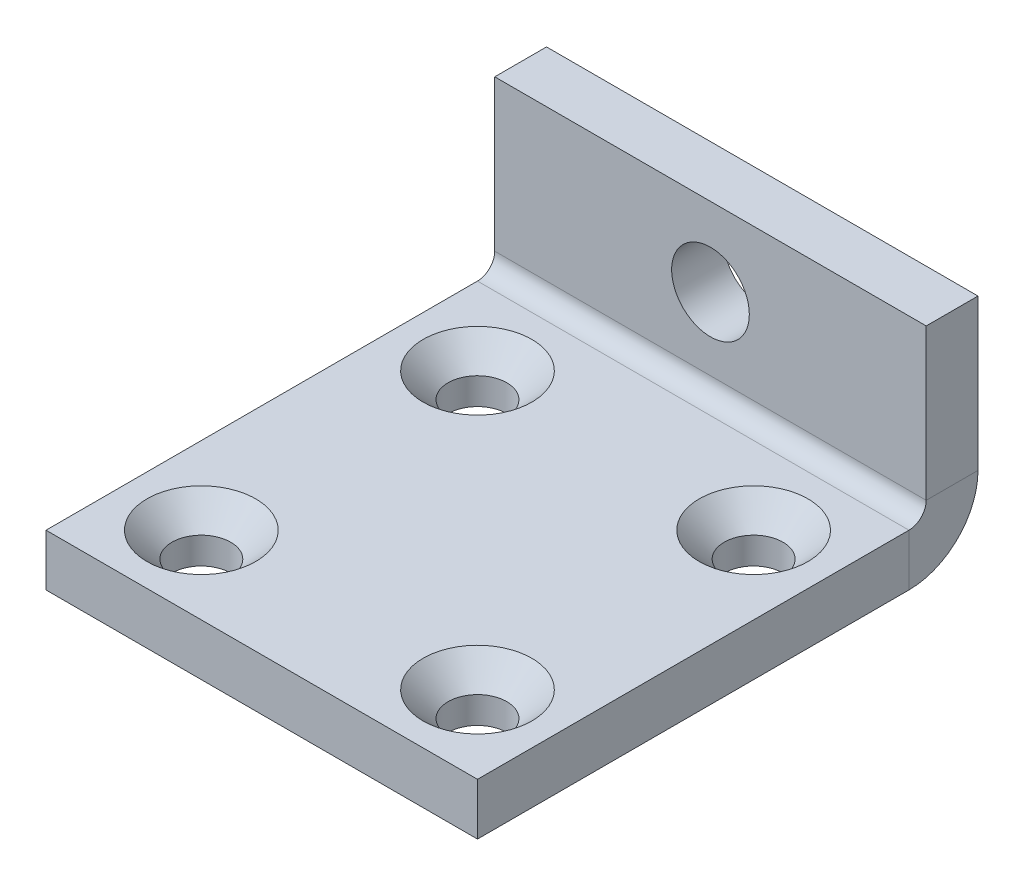
ISO-10303-21;
HEADER;
FILE_DESCRIPTION(('STEP AP214'),'2;1');
FILE_NAME('part.step','',(''),(''),'','','');
FILE_SCHEMA(('AUTOMOTIVE_DESIGN { 1 0 10303 214 1 1 1 1 }'));
ENDSEC;
DATA;
#1=APPLICATION_CONTEXT('core data for automotive mechanical design processes');
#2=APPLICATION_PROTOCOL_DEFINITION('international standard','automotive_design',2000,#1);
#3=PRODUCT_CONTEXT('',#1,'mechanical');
#4=PRODUCT('Part','Part','',(#3));
#5=PRODUCT_RELATED_PRODUCT_CATEGORY('part','',(#4));
#6=PRODUCT_DEFINITION_FORMATION('','',#4);
#7=PRODUCT_DEFINITION_CONTEXT('part definition',#1,'design');
#8=PRODUCT_DEFINITION('design','',#6,#7);
#9=PRODUCT_DEFINITION_SHAPE('','',#8);
#10=(LENGTH_UNIT() NAMED_UNIT(*) SI_UNIT(.MILLI.,.METRE.));
#11=(NAMED_UNIT(*) PLANE_ANGLE_UNIT() SI_UNIT($,.RADIAN.));
#12=(NAMED_UNIT(*) SI_UNIT($,.STERADIAN.) SOLID_ANGLE_UNIT());
#13=UNCERTAINTY_MEASURE_WITH_UNIT(LENGTH_MEASURE(1.E-05),#10,'distance_accuracy_value','');
#14=(GEOMETRIC_REPRESENTATION_CONTEXT(3) GLOBAL_UNCERTAINTY_ASSIGNED_CONTEXT((#13)) GLOBAL_UNIT_ASSIGNED_CONTEXT((#10,
#11,#12)) REPRESENTATION_CONTEXT('',''));
#15=CARTESIAN_POINT('',(0.,0.,0.));
#16=DIRECTION('',(0.,0.,1.));
#17=DIRECTION('',(1.,0.,0.));
#18=AXIS2_PLACEMENT_3D('',#15,#16,#17);
#19=CARTESIAN_POINT('',(25.,0.,3.99999999999999));
#20=DIRECTION('',(1.,0.,0.));
#21=DIRECTION('',(0.,0.,-1.));
#22=AXIS2_PLACEMENT_3D('',#19,#20,#21);
#23=PLANE('',#22);
#24=DIRECTION('',(0.,1.,0.));
#25=VECTOR('',#24,1.);
#26=CARTESIAN_POINT('',(25.,0.,3.99999999999999));
#27=LINE('',#26,#25);
#28=CARTESIAN_POINT('',(25.,0.,3.99999999999999));
#29=VERTEX_POINT('',#28);
#30=CARTESIAN_POINT('',(25.,3.,3.99999999999999));
#31=VERTEX_POINT('',#30);
#32=EDGE_CURVE('E11',#29,#31,#27,.T.);
#33=ORIENTED_EDGE('',*,*,#32,.F.);
#34=CARTESIAN_POINT('',(25.,4.,3.99999999999999));
#35=DIRECTION('',(-1.,0.,0.));
#36=DIRECTION('',(0.,0.,1.));
#37=AXIS2_PLACEMENT_3D('',#34,#35,#36);
#38=CIRCLE('',#37,4.);
#39=CARTESIAN_POINT('',(25.,4.,0.));
#40=VERTEX_POINT('',#39);
#41=EDGE_CURVE('E126',#29,#40,#38,.F.);
#42=ORIENTED_EDGE('',*,*,#41,.T.);
#43=DIRECTION('',(0.,0.,-1.));
#44=VECTOR('',#43,1.);
#45=CARTESIAN_POINT('',(25.,4.,2.99999999999999));
#46=LINE('',#45,#44);
#47=CARTESIAN_POINT('',(25.,4.,2.99999999999999));
#48=VERTEX_POINT('',#47);
#49=EDGE_CURVE('E44',#48,#40,#46,.T.);
#50=ORIENTED_EDGE('',*,*,#49,.F.);
#51=CARTESIAN_POINT('',(25.,4.,3.99999999999999));
#52=DIRECTION('',(1.,0.,0.));
#53=DIRECTION('',(0.,0.,-1.));
#54=AXIS2_PLACEMENT_3D('',#51,#52,#53);
#55=CIRCLE('',#54,1.);
#56=EDGE_CURVE('E133',#31,#48,#55,.T.);
#57=ORIENTED_EDGE('',*,*,#56,.F.);
#58=EDGE_LOOP('',(#33,#42,#50,#57));
#59=FACE_BOUND('',#58,.T.);
#60=ADVANCED_FACE('F36',(#59),#23,.T.);
#61=CARTESIAN_POINT('',(25.,4.,2.99999999999999));
#62=DIRECTION('',(1.,0.,0.));
#63=DIRECTION('',(0.,0.,-1.));
#64=AXIS2_PLACEMENT_3D('',#61,#62,#63);
#65=PLANE('',#64);
#66=DIRECTION('',(0.,0.,-1.));
#67=VECTOR('',#66,1.);
#68=CARTESIAN_POINT('',(25.,0.,0.));
#69=LINE('',#68,#67);
#70=CARTESIAN_POINT('',(25.,0.,29.));
#71=VERTEX_POINT('',#70);
#72=EDGE_CURVE('E121',#71,#29,#69,.T.);
#73=ORIENTED_EDGE('',*,*,#72,.T.);
#74=ORIENTED_EDGE('',*,*,#32,.T.);
#75=DIRECTION('',(0.,0.,-1.));
#76=VECTOR('',#75,1.);
#77=CARTESIAN_POINT('',(25.,3.,0.));
#78=LINE('',#77,#76);
#79=CARTESIAN_POINT('',(25.,3.,29.));
#80=VERTEX_POINT('',#79);
#81=EDGE_CURVE('E131',#80,#31,#78,.T.);
#82=ORIENTED_EDGE('',*,*,#81,.F.);
#83=DIRECTION('',(0.,1.,0.));
#84=VECTOR('',#83,1.);
#85=CARTESIAN_POINT('',(25.,0.,29.));
#86=LINE('',#85,#84);
#87=EDGE_CURVE('E112',#71,#80,#86,.T.);
#88=ORIENTED_EDGE('',*,*,#87,.F.);
#89=EDGE_LOOP('',(#73,#74,#82,#88));
#90=FACE_BOUND('',#89,.T.);
#91=ADVANCED_FACE('F129',(#90),#65,.T.);
#92=CARTESIAN_POINT('',(0.,4.,0.));
#93=DIRECTION('',(-1.,0.,0.));
#94=DIRECTION('',(0.,0.,1.));
#95=AXIS2_PLACEMENT_3D('',#92,#93,#94);
#96=PLANE('',#95);
#97=DIRECTION('',(0.,0.,1.));
#98=VECTOR('',#97,1.);
#99=CARTESIAN_POINT('',(0.,4.,0.));
#100=LINE('',#99,#98);
#101=CARTESIAN_POINT('',(0.,4.,0.));
#102=VERTEX_POINT('',#101);
#103=CARTESIAN_POINT('',(0.,4.,3.));
#104=VERTEX_POINT('',#103);
#105=EDGE_CURVE('E87',#102,#104,#100,.T.);
#106=ORIENTED_EDGE('',*,*,#105,.F.);
#107=CARTESIAN_POINT('',(0.,4.,4.));
#108=DIRECTION('',(-1.,0.,0.));
#109=DIRECTION('',(0.,0.,1.));
#110=AXIS2_PLACEMENT_3D('',#107,#108,#109);
#111=CIRCLE('',#110,4.);
#112=CARTESIAN_POINT('',(0.,0.,3.99999999999999));
#113=VERTEX_POINT('',#112);
#114=EDGE_CURVE('E156',#113,#102,#111,.F.);
#115=ORIENTED_EDGE('',*,*,#114,.F.);
#116=DIRECTION('',(0.,-1.,0.));
#117=VECTOR('',#116,1.);
#118=CARTESIAN_POINT('',(0.,3.,4.));
#119=LINE('',#118,#117);
#120=CARTESIAN_POINT('',(0.,3.,4.));
#121=VERTEX_POINT('',#120);
#122=EDGE_CURVE('E80',#121,#113,#119,.T.);
#123=ORIENTED_EDGE('',*,*,#122,.F.);
#124=CARTESIAN_POINT('',(0.,4.,4.));
#125=DIRECTION('',(1.,0.,0.));
#126=DIRECTION('',(0.,0.,-1.));
#127=AXIS2_PLACEMENT_3D('',#124,#125,#126);
#128=CIRCLE('',#127,1.);
#129=EDGE_CURVE('E149',#121,#104,#128,.T.);
#130=ORIENTED_EDGE('',*,*,#129,.T.);
#131=EDGE_LOOP('',(#106,#115,#123,#130));
#132=FACE_BOUND('',#131,.T.);
#133=ADVANCED_FACE('F188',(#132),#96,.T.);
#134=CARTESIAN_POINT('',(0.,3.,4.));
#135=DIRECTION('',(-1.,0.,0.));
#136=DIRECTION('',(0.,0.,1.));
#137=AXIS2_PLACEMENT_3D('',#134,#135,#136);
#138=PLANE('',#137);
#139=DIRECTION('',(0.,1.,0.));
#140=VECTOR('',#139,1.);
#141=CARTESIAN_POINT('',(0.,0.,0.));
#142=LINE('',#141,#140);
#143=CARTESIAN_POINT('',(0.,12.75,0.));
#144=VERTEX_POINT('',#143);
#145=EDGE_CURVE('E139',#102,#144,#142,.T.);
#146=ORIENTED_EDGE('',*,*,#145,.F.);
#147=ORIENTED_EDGE('',*,*,#105,.T.);
#148=DIRECTION('',(0.,1.,0.));
#149=VECTOR('',#148,1.);
#150=CARTESIAN_POINT('',(0.,0.,3.));
#151=LINE('',#150,#149);
#152=CARTESIAN_POINT('',(0.,12.75,3.));
#153=VERTEX_POINT('',#152);
#154=EDGE_CURVE('E146',#104,#153,#151,.T.);
#155=ORIENTED_EDGE('',*,*,#154,.T.);
#156=DIRECTION('',(0.,0.,-1.));
#157=VECTOR('',#156,1.);
#158=CARTESIAN_POINT('',(0.,12.75,3.));
#159=LINE('',#158,#157);
#160=EDGE_CURVE('E142',#153,#144,#159,.T.);
#161=ORIENTED_EDGE('',*,*,#160,.T.);
#162=EDGE_LOOP('',(#146,#147,#155,#161));
#163=FACE_BOUND('',#162,.T.);
#164=ADVANCED_FACE('F175',(#163),#138,.T.);
#165=CARTESIAN_POINT('',(25.,0.,0.));
#166=DIRECTION('',(0.,0.,1.));
#167=DIRECTION('',(1.,0.,0.));
#168=AXIS2_PLACEMENT_3D('',#165,#166,#167);
#169=PLANE('',#168);
#170=CARTESIAN_POINT('',(12.5,8.2,0.));
#171=DIRECTION('',(0.,0.,1.));
#172=DIRECTION('',(1.,0.,0.));
#173=AXIS2_PLACEMENT_3D('',#170,#171,#172);
#174=CIRCLE('',#173,2.25);
#175=CARTESIAN_POINT('',(14.75,8.2,0.));
#176=VERTEX_POINT('',#175);
#177=EDGE_CURVE('E235',#176,#176,#174,.T.);
#178=ORIENTED_EDGE('',*,*,#177,.T.);
#179=EDGE_LOOP('',(#178));
#180=FACE_BOUND('',#179,.T.);
#181=ORIENTED_EDGE('',*,*,#145,.T.);
#182=DIRECTION('',(-1.,0.,0.));
#183=VECTOR('',#182,1.);
#184=CARTESIAN_POINT('',(25.,12.75,0.));
#185=LINE('',#184,#183);
#186=CARTESIAN_POINT('',(25.,12.75,0.));
#187=VERTEX_POINT('',#186);
#188=EDGE_CURVE('E170',#187,#144,#185,.T.);
#189=ORIENTED_EDGE('',*,*,#188,.F.);
#190=DIRECTION('',(0.,1.,0.));
#191=VECTOR('',#190,1.);
#192=CARTESIAN_POINT('',(25.,0.,0.));
#193=LINE('',#192,#191);
#194=EDGE_CURVE('E93',#40,#187,#193,.T.);
#195=ORIENTED_EDGE('',*,*,#194,.F.);
#196=DIRECTION('',(-1.,0.,0.));
#197=VECTOR('',#196,1.);
#198=CARTESIAN_POINT('',(25.,4.,0.));
#199=LINE('',#198,#197);
#200=EDGE_CURVE('E138',#40,#102,#199,.T.);
#201=ORIENTED_EDGE('',*,*,#200,.T.);
#202=EDGE_LOOP('',(#181,#189,#195,#201));
#203=FACE_BOUND('',#202,.T.);
#204=ADVANCED_FACE('F252',(#180,#203),#169,.F.);
#205=CARTESIAN_POINT('',(25.,12.75,2.99999999999999));
#206=DIRECTION('',(0.,1.,0.));
#207=DIRECTION('',(0.,0.,1.));
#208=AXIS2_PLACEMENT_3D('',#205,#206,#207);
#209=PLANE('',#208);
#210=ORIENTED_EDGE('',*,*,#160,.F.);
#211=DIRECTION('',(-1.,0.,0.));
#212=VECTOR('',#211,1.);
#213=CARTESIAN_POINT('',(25.,12.75,2.99999999999999));
#214=LINE('',#213,#212);
#215=CARTESIAN_POINT('',(25.,12.75,2.99999999999999));
#216=VERTEX_POINT('',#215);
#217=EDGE_CURVE('E168',#216,#153,#214,.T.);
#218=ORIENTED_EDGE('',*,*,#217,.F.);
#219=DIRECTION('',(0.,0.,-1.));
#220=VECTOR('',#219,1.);
#221=CARTESIAN_POINT('',(25.,12.75,2.99999999999999));
#222=LINE('',#221,#220);
#223=EDGE_CURVE('E194',#216,#187,#222,.T.);
#224=ORIENTED_EDGE('',*,*,#223,.T.);
#225=ORIENTED_EDGE('',*,*,#188,.T.);
#226=EDGE_LOOP('',(#210,#218,#224,#225));
#227=FACE_BOUND('',#226,.T.);
#228=ADVANCED_FACE('F245',(#227),#209,.T.);
#229=CARTESIAN_POINT('',(25.,0.,2.99999999999999));
#230=DIRECTION('',(0.,0.,1.));
#231=DIRECTION('',(1.,0.,0.));
#232=AXIS2_PLACEMENT_3D('',#229,#230,#231);
#233=PLANE('',#232);
#234=CARTESIAN_POINT('',(12.5,8.2,3.));
#235=DIRECTION('',(0.,0.,1.));
#236=DIRECTION('',(1.,0.,0.));
#237=AXIS2_PLACEMENT_3D('',#234,#235,#236);
#238=CIRCLE('',#237,2.25);
#239=CARTESIAN_POINT('',(14.75,8.2,3.));
#240=VERTEX_POINT('',#239);
#241=EDGE_CURVE('E238',#240,#240,#238,.T.);
#242=ORIENTED_EDGE('',*,*,#241,.F.);
#243=EDGE_LOOP('',(#242));
#244=FACE_BOUND('',#243,.T.);
#245=ORIENTED_EDGE('',*,*,#154,.F.);
#246=DIRECTION('',(-1.,0.,0.));
#247=VECTOR('',#246,1.);
#248=CARTESIAN_POINT('',(25.,4.,2.99999999999999));
#249=LINE('',#248,#247);
#250=EDGE_CURVE('E165',#48,#104,#249,.T.);
#251=ORIENTED_EDGE('',*,*,#250,.F.);
#252=DIRECTION('',(0.,1.,0.));
#253=VECTOR('',#252,1.);
#254=CARTESIAN_POINT('',(25.,0.,2.99999999999999));
#255=LINE('',#254,#253);
#256=EDGE_CURVE('E193',#48,#216,#255,.T.);
#257=ORIENTED_EDGE('',*,*,#256,.T.);
#258=ORIENTED_EDGE('',*,*,#217,.T.);
#259=EDGE_LOOP('',(#245,#251,#257,#258));
#260=FACE_BOUND('',#259,.T.);
#261=ADVANCED_FACE('F186',(#244,#260),#233,.T.);
#262=CARTESIAN_POINT('',(25.,4.,3.99999999999999));
#263=DIRECTION('',(-1.,0.,0.));
#264=DIRECTION('',(0.,0.,1.));
#265=AXIS2_PLACEMENT_3D('',#262,#263,#264);
#266=CYLINDRICAL_SURFACE('',#265,1.);
#267=ORIENTED_EDGE('',*,*,#129,.F.);
#268=DIRECTION('',(-1.,0.,0.));
#269=VECTOR('',#268,1.);
#270=CARTESIAN_POINT('',(25.,3.,3.99999999999999));
#271=LINE('',#270,#269);
#272=EDGE_CURVE('E162',#31,#121,#271,.T.);
#273=ORIENTED_EDGE('',*,*,#272,.F.);
#274=ORIENTED_EDGE('',*,*,#56,.T.);
#275=ORIENTED_EDGE('',*,*,#250,.T.);
#276=EDGE_LOOP('',(#267,#273,#274,#275));
#277=FACE_BOUND('',#276,.T.);
#278=ADVANCED_FACE('F181',(#277),#266,.F.);
#279=CARTESIAN_POINT('',(25.,3.,0.));
#280=DIRECTION('',(0.,1.,0.));
#281=DIRECTION('',(0.,0.,1.));
#282=AXIS2_PLACEMENT_3D('',#279,#280,#281);
#283=PLANE('',#282);
#284=CARTESIAN_POINT('',(4.5,3.,24.5));
#285=DIRECTION('',(0.,1.,0.));
#286=DIRECTION('',(0.,0.,1.));
#287=AXIS2_PLACEMENT_3D('',#284,#285,#286);
#288=CIRCLE('',#287,3.15);
#289=CARTESIAN_POINT('',(4.5,3.,27.65));
#290=VERTEX_POINT('',#289);
#291=EDGE_CURVE('E232',#290,#290,#288,.T.);
#292=ORIENTED_EDGE('',*,*,#291,.F.);
#293=EDGE_LOOP('',(#292));
#294=FACE_BOUND('',#293,.T.);
#295=CARTESIAN_POINT('',(4.5,3.,8.49999999999999));
#296=DIRECTION('',(0.,1.,0.));
#297=DIRECTION('',(0.,0.,1.));
#298=AXIS2_PLACEMENT_3D('',#295,#296,#297);
#299=CIRCLE('',#298,3.15);
#300=CARTESIAN_POINT('',(4.5,3.,11.65));
#301=VERTEX_POINT('',#300);
#302=EDGE_CURVE('E223',#301,#301,#299,.T.);
#303=ORIENTED_EDGE('',*,*,#302,.F.);
#304=EDGE_LOOP('',(#303));
#305=FACE_BOUND('',#304,.T.);
#306=CARTESIAN_POINT('',(20.5,3.,8.49999999999999));
#307=DIRECTION('',(0.,1.,0.));
#308=DIRECTION('',(0.,0.,1.));
#309=AXIS2_PLACEMENT_3D('',#306,#307,#308);
#310=CIRCLE('',#309,3.15);
#311=CARTESIAN_POINT('',(20.5,3.,11.65));
#312=VERTEX_POINT('',#311);
#313=EDGE_CURVE('E214',#312,#312,#310,.T.);
#314=ORIENTED_EDGE('',*,*,#313,.F.);
#315=EDGE_LOOP('',(#314));
#316=FACE_BOUND('',#315,.T.);
#317=CARTESIAN_POINT('',(20.5,3.,24.5));
#318=DIRECTION('',(0.,1.,0.));
#319=DIRECTION('',(0.,0.,1.));
#320=AXIS2_PLACEMENT_3D('',#317,#318,#319);
#321=CIRCLE('',#320,3.15);
#322=CARTESIAN_POINT('',(20.5,3.,27.65));
#323=VERTEX_POINT('',#322);
#324=EDGE_CURVE('E205',#323,#323,#321,.T.);
#325=ORIENTED_EDGE('',*,*,#324,.F.);
#326=EDGE_LOOP('',(#325));
#327=FACE_BOUND('',#326,.T.);
#328=DIRECTION('',(0.,0.,-1.));
#329=VECTOR('',#328,1.);
#330=CARTESIAN_POINT('',(0.,3.,0.));
#331=LINE('',#330,#329);
#332=CARTESIAN_POINT('',(0.,3.,29.));
#333=VERTEX_POINT('',#332);
#334=EDGE_CURVE('E151',#333,#121,#331,.T.);
#335=ORIENTED_EDGE('',*,*,#334,.F.);
#336=DIRECTION('',(-1.,0.,0.));
#337=VECTOR('',#336,1.);
#338=CARTESIAN_POINT('',(25.,3.,29.));
#339=LINE('',#338,#337);
#340=EDGE_CURVE('E116',#80,#333,#339,.T.);
#341=ORIENTED_EDGE('',*,*,#340,.F.);
#342=ORIENTED_EDGE('',*,*,#81,.T.);
#343=ORIENTED_EDGE('',*,*,#272,.T.);
#344=EDGE_LOOP('',(#335,#341,#342,#343));
#345=FACE_BOUND('',#344,.T.);
#346=ADVANCED_FACE('F191',(#294,#305,#316,#327,#345),#283,.T.);
#347=CARTESIAN_POINT('',(25.,0.,29.));
#348=DIRECTION('',(0.,0.,1.));
#349=DIRECTION('',(1.,0.,0.));
#350=AXIS2_PLACEMENT_3D('',#347,#348,#349);
#351=PLANE('',#350);
#352=DIRECTION('',(0.,1.,0.));
#353=VECTOR('',#352,1.);
#354=CARTESIAN_POINT('',(0.,0.,29.));
#355=LINE('',#354,#353);
#356=CARTESIAN_POINT('',(0.,0.,29.));
#357=VERTEX_POINT('',#356);
#358=EDGE_CURVE('E114',#357,#333,#355,.T.);
#359=ORIENTED_EDGE('',*,*,#358,.F.);
#360=DIRECTION('',(-1.,0.,0.));
#361=VECTOR('',#360,1.);
#362=CARTESIAN_POINT('',(25.,0.,29.));
#363=LINE('',#362,#361);
#364=EDGE_CURVE('E108',#71,#357,#363,.T.);
#365=ORIENTED_EDGE('',*,*,#364,.F.);
#366=ORIENTED_EDGE('',*,*,#87,.T.);
#367=ORIENTED_EDGE('',*,*,#340,.T.);
#368=EDGE_LOOP('',(#359,#365,#366,#367));
#369=FACE_BOUND('',#368,.T.);
#370=ADVANCED_FACE('F110',(#369),#351,.T.);
#371=CARTESIAN_POINT('',(25.,0.,0.));
#372=DIRECTION('',(0.,1.,0.));
#373=DIRECTION('',(0.,0.,1.));
#374=AXIS2_PLACEMENT_3D('',#371,#372,#373);
#375=PLANE('',#374);
#376=CARTESIAN_POINT('',(4.5,0.,24.5));
#377=DIRECTION('',(0.,1.,0.));
#378=DIRECTION('',(0.,0.,1.));
#379=AXIS2_PLACEMENT_3D('',#376,#377,#378);
#380=CIRCLE('',#379,1.69999999999999);
#381=CARTESIAN_POINT('',(4.5,0.,26.2));
#382=VERTEX_POINT('',#381);
#383=EDGE_CURVE('E226',#382,#382,#380,.T.);
#384=ORIENTED_EDGE('',*,*,#383,.T.);
#385=EDGE_LOOP('',(#384));
#386=FACE_BOUND('',#385,.T.);
#387=CARTESIAN_POINT('',(4.5,0.,8.49999999999999));
#388=DIRECTION('',(0.,1.,0.));
#389=DIRECTION('',(0.,0.,1.));
#390=AXIS2_PLACEMENT_3D('',#387,#388,#389);
#391=CIRCLE('',#390,1.69999999999999);
#392=CARTESIAN_POINT('',(4.5,0.,10.2));
#393=VERTEX_POINT('',#392);
#394=EDGE_CURVE('E217',#393,#393,#391,.T.);
#395=ORIENTED_EDGE('',*,*,#394,.T.);
#396=EDGE_LOOP('',(#395));
#397=FACE_BOUND('',#396,.T.);
#398=CARTESIAN_POINT('',(20.5,0.,8.49999999999999));
#399=DIRECTION('',(0.,1.,0.));
#400=DIRECTION('',(0.,0.,1.));
#401=AXIS2_PLACEMENT_3D('',#398,#399,#400);
#402=CIRCLE('',#401,1.69999999999999);
#403=CARTESIAN_POINT('',(20.5,0.,10.2));
#404=VERTEX_POINT('',#403);
#405=EDGE_CURVE('E208',#404,#404,#402,.T.);
#406=ORIENTED_EDGE('',*,*,#405,.T.);
#407=EDGE_LOOP('',(#406));
#408=FACE_BOUND('',#407,.T.);
#409=CARTESIAN_POINT('',(20.5,0.,24.5));
#410=DIRECTION('',(0.,1.,0.));
#411=DIRECTION('',(0.,0.,1.));
#412=AXIS2_PLACEMENT_3D('',#409,#410,#411);
#413=CIRCLE('',#412,1.69999999999999);
#414=CARTESIAN_POINT('',(20.5,0.,26.2));
#415=VERTEX_POINT('',#414);
#416=EDGE_CURVE('E143',#415,#415,#413,.T.);
#417=ORIENTED_EDGE('',*,*,#416,.T.);
#418=EDGE_LOOP('',(#417));
#419=FACE_BOUND('',#418,.T.);
#420=DIRECTION('',(0.,0.,-1.));
#421=VECTOR('',#420,1.);
#422=CARTESIAN_POINT('',(0.,0.,0.));
#423=LINE('',#422,#421);
#424=EDGE_CURVE('E154',#357,#113,#423,.T.);
#425=ORIENTED_EDGE('',*,*,#424,.T.);
#426=DIRECTION('',(-1.,0.,0.));
#427=VECTOR('',#426,1.);
#428=CARTESIAN_POINT('',(25.,0.,3.99999999999999));
#429=LINE('',#428,#427);
#430=EDGE_CURVE('E117',#29,#113,#429,.T.);
#431=ORIENTED_EDGE('',*,*,#430,.F.);
#432=ORIENTED_EDGE('',*,*,#72,.F.);
#433=ORIENTED_EDGE('',*,*,#364,.T.);
#434=EDGE_LOOP('',(#425,#431,#432,#433));
#435=FACE_BOUND('',#434,.T.);
#436=ADVANCED_FACE('F122',(#386,#397,#408,#419,#435),#375,.F.);
#437=CARTESIAN_POINT('',(25.,4.,3.99999999999999));
#438=DIRECTION('',(-1.,0.,0.));
#439=DIRECTION('',(0.,0.,1.));
#440=AXIS2_PLACEMENT_3D('',#437,#438,#439);
#441=CYLINDRICAL_SURFACE('',#440,4.);
#442=ORIENTED_EDGE('',*,*,#114,.T.);
#443=ORIENTED_EDGE('',*,*,#200,.F.);
#444=ORIENTED_EDGE('',*,*,#41,.F.);
#445=ORIENTED_EDGE('',*,*,#430,.T.);
#446=EDGE_LOOP('',(#442,#443,#444,#445));
#447=FACE_BOUND('',#446,.T.);
#448=ADVANCED_FACE('F276',(#447),#441,.T.);
#449=CARTESIAN_POINT('',(25.,4.,3.99999999999999));
#450=DIRECTION('',(1.,0.,0.));
#451=DIRECTION('',(0.,0.,-1.));
#452=AXIS2_PLACEMENT_3D('',#449,#450,#451);
#453=PLANE('',#452);
#454=ORIENTED_EDGE('',*,*,#194,.T.);
#455=ORIENTED_EDGE('',*,*,#223,.F.);
#456=ORIENTED_EDGE('',*,*,#256,.F.);
#457=ORIENTED_EDGE('',*,*,#49,.T.);
#458=EDGE_LOOP('',(#454,#455,#456,#457));
#459=FACE_BOUND('',#458,.T.);
#460=ADVANCED_FACE('F273',(#459),#453,.T.);
#461=CARTESIAN_POINT('',(0.,4.,4.));
#462=DIRECTION('',(1.,0.,0.));
#463=DIRECTION('',(0.,0.,-1.));
#464=AXIS2_PLACEMENT_3D('',#461,#462,#463);
#465=PLANE('',#464);
#466=ORIENTED_EDGE('',*,*,#334,.T.);
#467=ORIENTED_EDGE('',*,*,#122,.T.);
#468=ORIENTED_EDGE('',*,*,#424,.F.);
#469=ORIENTED_EDGE('',*,*,#358,.T.);
#470=EDGE_LOOP('',(#466,#467,#468,#469));
#471=FACE_BOUND('',#470,.T.);
#472=ADVANCED_FACE('F275',(#471),#465,.F.);
#473=CARTESIAN_POINT('',(20.5,3.,24.5));
#474=DIRECTION('',(0.,1.,0.));
#475=DIRECTION('',(0.,0.,1.));
#476=AXIS2_PLACEMENT_3D('',#473,#474,#475);
#477=CYLINDRICAL_SURFACE('',#476,1.69999999999999);
#478=ORIENTED_EDGE('',*,*,#416,.F.);
#479=EDGE_LOOP('',(#478));
#480=FACE_BOUND('',#479,.T.);
#481=CARTESIAN_POINT('',(20.5,1.54999999999999,24.5));
#482=DIRECTION('',(0.,1.,0.));
#483=DIRECTION('',(0.,0.,1.));
#484=AXIS2_PLACEMENT_3D('',#481,#482,#483);
#485=CIRCLE('',#484,1.69999999999999);
#486=CARTESIAN_POINT('',(20.5,1.54999999999999,26.2));
#487=VERTEX_POINT('',#486);
#488=EDGE_CURVE('E202',#487,#487,#485,.T.);
#489=ORIENTED_EDGE('',*,*,#488,.T.);
#490=EDGE_LOOP('',(#489));
#491=FACE_BOUND('',#490,.T.);
#492=ADVANCED_FACE('F282',(#480,#491),#477,.F.);
#493=CARTESIAN_POINT('',(20.5,3.,24.5));
#494=DIRECTION('',(0.,1.,0.));
#495=DIRECTION('',(0.,0.,1.));
#496=AXIS2_PLACEMENT_3D('',#493,#494,#495);
#497=CONICAL_SURFACE('',#496,3.15,0.785398163397449);
#498=ORIENTED_EDGE('',*,*,#488,.F.);
#499=EDGE_LOOP('',(#498));
#500=FACE_BOUND('',#499,.T.);
#501=ORIENTED_EDGE('',*,*,#324,.T.);
#502=EDGE_LOOP('',(#501));
#503=FACE_BOUND('',#502,.T.);
#504=ADVANCED_FACE('F306',(#500,#503),#497,.F.);
#505=CARTESIAN_POINT('',(20.5,3.,8.49999999999999));
#506=DIRECTION('',(0.,1.,0.));
#507=DIRECTION('',(0.,0.,1.));
#508=AXIS2_PLACEMENT_3D('',#505,#506,#507);
#509=CYLINDRICAL_SURFACE('',#508,1.69999999999999);
#510=ORIENTED_EDGE('',*,*,#405,.F.);
#511=EDGE_LOOP('',(#510));
#512=FACE_BOUND('',#511,.T.);
#513=CARTESIAN_POINT('',(20.5,1.54999999999999,8.49999999999999));
#514=DIRECTION('',(0.,1.,0.));
#515=DIRECTION('',(0.,0.,1.));
#516=AXIS2_PLACEMENT_3D('',#513,#514,#515);
#517=CIRCLE('',#516,1.69999999999999);
#518=CARTESIAN_POINT('',(20.5,1.54999999999999,10.2));
#519=VERTEX_POINT('',#518);
#520=EDGE_CURVE('E211',#519,#519,#517,.T.);
#521=ORIENTED_EDGE('',*,*,#520,.T.);
#522=EDGE_LOOP('',(#521));
#523=FACE_BOUND('',#522,.T.);
#524=ADVANCED_FACE('F308',(#512,#523),#509,.F.);
#525=CARTESIAN_POINT('',(20.5,3.,8.49999999999999));
#526=DIRECTION('',(0.,1.,0.));
#527=DIRECTION('',(0.,0.,1.));
#528=AXIS2_PLACEMENT_3D('',#525,#526,#527);
#529=CONICAL_SURFACE('',#528,3.15,0.785398163397449);
#530=ORIENTED_EDGE('',*,*,#520,.F.);
#531=EDGE_LOOP('',(#530));
#532=FACE_BOUND('',#531,.T.);
#533=ORIENTED_EDGE('',*,*,#313,.T.);
#534=EDGE_LOOP('',(#533));
#535=FACE_BOUND('',#534,.T.);
#536=ADVANCED_FACE('F314',(#532,#535),#529,.F.);
#537=CARTESIAN_POINT('',(4.5,3.,8.49999999999999));
#538=DIRECTION('',(0.,1.,0.));
#539=DIRECTION('',(0.,0.,1.));
#540=AXIS2_PLACEMENT_3D('',#537,#538,#539);
#541=CYLINDRICAL_SURFACE('',#540,1.69999999999999);
#542=ORIENTED_EDGE('',*,*,#394,.F.);
#543=EDGE_LOOP('',(#542));
#544=FACE_BOUND('',#543,.T.);
#545=CARTESIAN_POINT('',(4.5,1.54999999999999,8.49999999999999));
#546=DIRECTION('',(0.,1.,0.));
#547=DIRECTION('',(0.,0.,1.));
#548=AXIS2_PLACEMENT_3D('',#545,#546,#547);
#549=CIRCLE('',#548,1.69999999999999);
#550=CARTESIAN_POINT('',(4.5,1.54999999999999,10.2));
#551=VERTEX_POINT('',#550);
#552=EDGE_CURVE('E220',#551,#551,#549,.T.);
#553=ORIENTED_EDGE('',*,*,#552,.T.);
#554=EDGE_LOOP('',(#553));
#555=FACE_BOUND('',#554,.T.);
#556=ADVANCED_FACE('F322',(#544,#555),#541,.F.);
#557=CARTESIAN_POINT('',(4.5,3.,8.49999999999999));
#558=DIRECTION('',(0.,1.,0.));
#559=DIRECTION('',(0.,0.,1.));
#560=AXIS2_PLACEMENT_3D('',#557,#558,#559);
#561=CONICAL_SURFACE('',#560,3.15,0.78539816339745);
#562=ORIENTED_EDGE('',*,*,#552,.F.);
#563=EDGE_LOOP('',(#562));
#564=FACE_BOUND('',#563,.T.);
#565=ORIENTED_EDGE('',*,*,#302,.T.);
#566=EDGE_LOOP('',(#565));
#567=FACE_BOUND('',#566,.T.);
#568=ADVANCED_FACE('F326',(#564,#567),#561,.F.);
#569=CARTESIAN_POINT('',(4.5,3.,24.5));
#570=DIRECTION('',(0.,1.,0.));
#571=DIRECTION('',(0.,0.,1.));
#572=AXIS2_PLACEMENT_3D('',#569,#570,#571);
#573=CYLINDRICAL_SURFACE('',#572,1.69999999999999);
#574=ORIENTED_EDGE('',*,*,#383,.F.);
#575=EDGE_LOOP('',(#574));
#576=FACE_BOUND('',#575,.T.);
#577=CARTESIAN_POINT('',(4.5,1.54999999999999,24.5));
#578=DIRECTION('',(0.,1.,0.));
#579=DIRECTION('',(0.,0.,1.));
#580=AXIS2_PLACEMENT_3D('',#577,#578,#579);
#581=CIRCLE('',#580,1.69999999999999);
#582=CARTESIAN_POINT('',(4.5,1.54999999999999,26.2));
#583=VERTEX_POINT('',#582);
#584=EDGE_CURVE('E229',#583,#583,#581,.T.);
#585=ORIENTED_EDGE('',*,*,#584,.T.);
#586=EDGE_LOOP('',(#585));
#587=FACE_BOUND('',#586,.T.);
#588=ADVANCED_FACE('F330',(#576,#587),#573,.F.);
#589=CARTESIAN_POINT('',(4.5,3.,24.5));
#590=DIRECTION('',(0.,1.,0.));
#591=DIRECTION('',(0.,0.,1.));
#592=AXIS2_PLACEMENT_3D('',#589,#590,#591);
#593=CONICAL_SURFACE('',#592,3.15,0.78539816339745);
#594=ORIENTED_EDGE('',*,*,#584,.F.);
#595=EDGE_LOOP('',(#594));
#596=FACE_BOUND('',#595,.T.);
#597=ORIENTED_EDGE('',*,*,#291,.T.);
#598=EDGE_LOOP('',(#597));
#599=FACE_BOUND('',#598,.T.);
#600=ADVANCED_FACE('F334',(#596,#599),#593,.F.);
#601=CARTESIAN_POINT('',(12.5,8.2,3.));
#602=DIRECTION('',(0.,0.,1.));
#603=DIRECTION('',(1.,0.,0.));
#604=AXIS2_PLACEMENT_3D('',#601,#602,#603);
#605=CYLINDRICAL_SURFACE('',#604,2.25);
#606=ORIENTED_EDGE('',*,*,#177,.F.);
#607=EDGE_LOOP('',(#606));
#608=FACE_BOUND('',#607,.T.);
#609=ORIENTED_EDGE('',*,*,#241,.T.);
#610=EDGE_LOOP('',(#609));
#611=FACE_BOUND('',#610,.T.);
#612=ADVANCED_FACE('F242',(#608,#611),#605,.F.);
#613=CLOSED_SHELL('',(#60,#91,#133,#164,#204,#228,#261,#278,#346,#370,#436,#448,#460,#472,#492,
#504,#524,#536,#556,#568,#588,#600,#612));
#614=MANIFOLD_SOLID_BREP('B2',#613);
#615=ADVANCED_BREP_SHAPE_REPRESENTATION('',(#18,#614),#14);
#616=SHAPE_DEFINITION_REPRESENTATION(#9,#615);
ENDSEC;
END-ISO-10303-21;
